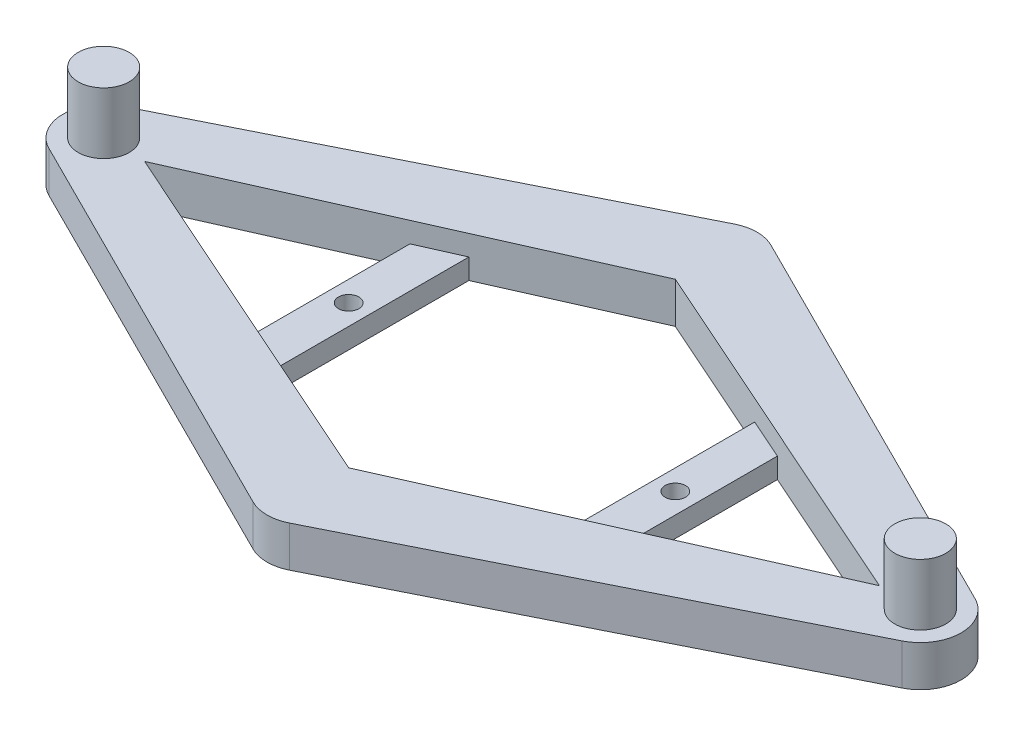
ISO-10303-21;
HEADER;
FILE_DESCRIPTION(('STEP AP214'),'2;1');
FILE_NAME('part.step','',(''),(''),'','','');
FILE_SCHEMA(('AUTOMOTIVE_DESIGN { 1 0 10303 214 1 1 1 1 }'));
ENDSEC;
DATA;
#1=APPLICATION_CONTEXT('core data for automotive mechanical design processes');
#2=APPLICATION_PROTOCOL_DEFINITION('international standard','automotive_design',2000,#1);
#3=PRODUCT_CONTEXT('',#1,'mechanical');
#4=PRODUCT('Part','Part','',(#3));
#5=PRODUCT_RELATED_PRODUCT_CATEGORY('part','',(#4));
#6=PRODUCT_DEFINITION_FORMATION('','',#4);
#7=PRODUCT_DEFINITION_CONTEXT('part definition',#1,'design');
#8=PRODUCT_DEFINITION('design','',#6,#7);
#9=PRODUCT_DEFINITION_SHAPE('','',#8);
#10=(LENGTH_UNIT() NAMED_UNIT(*) SI_UNIT(.MILLI.,.METRE.));
#11=(NAMED_UNIT(*) PLANE_ANGLE_UNIT() SI_UNIT($,.RADIAN.));
#12=(NAMED_UNIT(*) SI_UNIT($,.STERADIAN.) SOLID_ANGLE_UNIT());
#13=UNCERTAINTY_MEASURE_WITH_UNIT(LENGTH_MEASURE(1.E-05),#10,'distance_accuracy_value','');
#14=(GEOMETRIC_REPRESENTATION_CONTEXT(3) GLOBAL_UNCERTAINTY_ASSIGNED_CONTEXT((#13)) GLOBAL_UNIT_ASSIGNED_CONTEXT((#10,
#11,#12)) REPRESENTATION_CONTEXT('',''));
#15=CARTESIAN_POINT('',(0.,0.,0.));
#16=DIRECTION('',(0.,0.,1.));
#17=DIRECTION('',(1.,0.,0.));
#18=AXIS2_PLACEMENT_3D('',#15,#16,#17);
#19=CARTESIAN_POINT('',(45.72,5.08,0.));
#20=DIRECTION('',(-0.406138466053448,0.,-0.913811548620257));
#21=DIRECTION('',(-0.913811548620257,0.,0.406138466053448));
#22=AXIS2_PLACEMENT_3D('',#19,#20,#21);
#23=PLANE('',#22);
#24=DIRECTION('',(0.913811548620257,0.,-0.406138466053448));
#25=VECTOR('',#24,1.);
#26=CARTESIAN_POINT('',(45.72,0.,0.));
#27=LINE('',#26,#25);
#28=CARTESIAN_POINT('',(22.86,0.,10.16));
#29=VERTEX_POINT('',#28);
#30=CARTESIAN_POINT('',(45.72,0.,0.));
#31=VERTEX_POINT('',#30);
#32=EDGE_CURVE('E221',#29,#31,#27,.T.);
#33=ORIENTED_EDGE('',*,*,#32,.F.);
#34=DIRECTION('',(0.,-1.,0.));
#35=VECTOR('',#34,1.);
#36=CARTESIAN_POINT('',(22.86,2.54,10.16));
#37=LINE('',#36,#35);
#38=CARTESIAN_POINT('',(22.86,2.54,10.16));
#39=VERTEX_POINT('',#38);
#40=EDGE_CURVE('E199',#39,#29,#37,.T.);
#41=ORIENTED_EDGE('',*,*,#40,.F.);
#42=DIRECTION('',(0.913811548620257,0.,-0.406138466053447));
#43=VECTOR('',#42,1.);
#44=CARTESIAN_POINT('',(22.86,2.54,10.16));
#45=LINE('',#44,#43);
#46=CARTESIAN_POINT('',(17.78,2.54,12.4177777777778));
#47=VERTEX_POINT('',#46);
#48=EDGE_CURVE('E177',#47,#39,#45,.T.);
#49=ORIENTED_EDGE('',*,*,#48,.F.);
#50=DIRECTION('',(0.,-1.,0.));
#51=VECTOR('',#50,1.);
#52=CARTESIAN_POINT('',(17.78,2.54,12.4177777777778));
#53=LINE('',#52,#51);
#54=CARTESIAN_POINT('',(17.78,0.,12.4177777777778));
#55=VERTEX_POINT('',#54);
#56=EDGE_CURVE('E204',#47,#55,#53,.T.);
#57=ORIENTED_EDGE('',*,*,#56,.T.);
#58=CARTESIAN_POINT('',(0.,0.,20.32));
#59=VERTEX_POINT('',#58);
#60=EDGE_CURVE('E222',#59,#55,#27,.T.);
#61=ORIENTED_EDGE('',*,*,#60,.F.);
#62=DIRECTION('',(0.,-1.,0.));
#63=VECTOR('',#62,1.);
#64=CARTESIAN_POINT('',(0.,5.08,20.32));
#65=LINE('',#64,#63);
#66=CARTESIAN_POINT('',(0.,5.08,20.32));
#67=VERTEX_POINT('',#66);
#68=EDGE_CURVE('E239',#67,#59,#65,.T.);
#69=ORIENTED_EDGE('',*,*,#68,.F.);
#70=DIRECTION('',(0.913811548620257,0.,-0.406138466053448));
#71=VECTOR('',#70,1.);
#72=CARTESIAN_POINT('',(45.72,5.08,0.));
#73=LINE('',#72,#71);
#74=CARTESIAN_POINT('',(45.72,5.08,0.));
#75=VERTEX_POINT('',#74);
#76=EDGE_CURVE('E209',#67,#75,#73,.T.);
#77=ORIENTED_EDGE('',*,*,#76,.T.);
#78=DIRECTION('',(0.,-1.,0.));
#79=VECTOR('',#78,1.);
#80=CARTESIAN_POINT('',(45.72,5.08,0.));
#81=LINE('',#80,#79);
#82=EDGE_CURVE('E236',#75,#31,#81,.T.);
#83=ORIENTED_EDGE('',*,*,#82,.T.);
#84=EDGE_LOOP('',(#33,#41,#49,#57,#61,#69,#77,#83));
#85=FACE_BOUND('',#84,.T.);
#86=ADVANCED_FACE('F33',(#85),#23,.T.);
#87=CARTESIAN_POINT('',(0.,5.08,-20.32));
#88=DIRECTION('',(-0.406138466053448,0.,0.913811548620257));
#89=DIRECTION('',(0.913811548620257,0.,0.406138466053448));
#90=AXIS2_PLACEMENT_3D('',#87,#88,#89);
#91=PLANE('',#90);
#92=DIRECTION('',(-0.913811548620257,0.,-0.406138466053448));
#93=VECTOR('',#92,1.);
#94=CARTESIAN_POINT('',(22.86,2.54,-10.16));
#95=LINE('',#94,#93);
#96=CARTESIAN_POINT('',(22.86,2.54,-10.16));
#97=VERTEX_POINT('',#96);
#98=CARTESIAN_POINT('',(17.78,2.54,-12.4177777777778));
#99=VERTEX_POINT('',#98);
#100=EDGE_CURVE('E174',#97,#99,#95,.T.);
#101=ORIENTED_EDGE('',*,*,#100,.F.);
#102=DIRECTION('',(0.,-1.,0.));
#103=VECTOR('',#102,1.);
#104=CARTESIAN_POINT('',(22.86,2.54,-10.16));
#105=LINE('',#104,#103);
#106=CARTESIAN_POINT('',(22.86,0.,-10.16));
#107=VERTEX_POINT('',#106);
#108=EDGE_CURVE('E182',#97,#107,#105,.T.);
#109=ORIENTED_EDGE('',*,*,#108,.T.);
#110=DIRECTION('',(-0.913811548620257,0.,-0.406138466053448));
#111=VECTOR('',#110,1.);
#112=CARTESIAN_POINT('',(0.,0.,-20.32));
#113=LINE('',#112,#111);
#114=EDGE_CURVE('E226',#31,#107,#113,.T.);
#115=ORIENTED_EDGE('',*,*,#114,.F.);
#116=ORIENTED_EDGE('',*,*,#82,.F.);
#117=DIRECTION('',(-0.913811548620257,0.,-0.406138466053448));
#118=VECTOR('',#117,1.);
#119=CARTESIAN_POINT('',(0.,5.08,-20.32));
#120=LINE('',#119,#118);
#121=CARTESIAN_POINT('',(0.,5.08,-20.32));
#122=VERTEX_POINT('',#121);
#123=EDGE_CURVE('E212',#75,#122,#120,.T.);
#124=ORIENTED_EDGE('',*,*,#123,.T.);
#125=DIRECTION('',(0.,-1.,0.));
#126=VECTOR('',#125,1.);
#127=CARTESIAN_POINT('',(0.,5.08,-20.32));
#128=LINE('',#127,#126);
#129=CARTESIAN_POINT('',(0.,0.,-20.32));
#130=VERTEX_POINT('',#129);
#131=EDGE_CURVE('E233',#122,#130,#128,.T.);
#132=ORIENTED_EDGE('',*,*,#131,.T.);
#133=CARTESIAN_POINT('',(17.78,0.,-12.4177777777778));
#134=VERTEX_POINT('',#133);
#135=EDGE_CURVE('E225',#134,#130,#113,.T.);
#136=ORIENTED_EDGE('',*,*,#135,.F.);
#137=DIRECTION('',(0.,-1.,0.));
#138=VECTOR('',#137,1.);
#139=CARTESIAN_POINT('',(17.78,2.54,-12.4177777777778));
#140=LINE('',#139,#138);
#141=EDGE_CURVE('E190',#99,#134,#140,.T.);
#142=ORIENTED_EDGE('',*,*,#141,.F.);
#143=EDGE_LOOP('',(#101,#109,#115,#116,#124,#132,#136,#142));
#144=FACE_BOUND('',#143,.T.);
#145=ADVANCED_FACE('F192',(#144),#91,.T.);
#146=CARTESIAN_POINT('',(0.,2.54,0.));
#147=DIRECTION('',(0.,-1.,0.));
#148=DIRECTION('',(0.,0.,-1.));
#149=AXIS2_PLACEMENT_3D('',#146,#147,#148);
#150=PLANE('',#149);
#151=DIRECTION('',(-0.913811548620257,0.,0.406138466053448));
#152=VECTOR('',#151,1.);
#153=CARTESIAN_POINT('',(-22.86,2.54,-10.16));
#154=LINE('',#153,#152);
#155=CARTESIAN_POINT('',(-17.78,2.54,-12.4177777777778));
#156=VERTEX_POINT('',#155);
#157=CARTESIAN_POINT('',(-22.86,2.54,-10.16));
#158=VERTEX_POINT('',#157);
#159=EDGE_CURVE('E307',#156,#158,#154,.T.);
#160=ORIENTED_EDGE('',*,*,#159,.T.);
#161=DIRECTION('',(0.,0.,1.));
#162=VECTOR('',#161,1.);
#163=CARTESIAN_POINT('',(-22.86,2.54,-10.16));
#164=LINE('',#163,#162);
#165=CARTESIAN_POINT('',(-22.86,2.54,10.16));
#166=VERTEX_POINT('',#165);
#167=EDGE_CURVE('E310',#158,#166,#164,.T.);
#168=ORIENTED_EDGE('',*,*,#167,.T.);
#169=DIRECTION('',(0.913811548620257,0.,0.406138466053447));
#170=VECTOR('',#169,1.);
#171=CARTESIAN_POINT('',(-22.86,2.54,10.16));
#172=LINE('',#171,#170);
#173=CARTESIAN_POINT('',(-17.78,2.54,12.4177777777778));
#174=VERTEX_POINT('',#173);
#175=EDGE_CURVE('E314',#166,#174,#172,.T.);
#176=ORIENTED_EDGE('',*,*,#175,.T.);
#177=DIRECTION('',(0.,0.,-1.));
#178=VECTOR('',#177,1.);
#179=CARTESIAN_POINT('',(-17.78,2.54,-12.4177777777778));
#180=LINE('',#179,#178);
#181=EDGE_CURVE('E317',#174,#156,#180,.T.);
#182=ORIENTED_EDGE('',*,*,#181,.T.);
#183=EDGE_LOOP('',(#160,#168,#176,#182));
#184=FACE_BOUND('',#183,.T.);
#185=CARTESIAN_POINT('',(-20.32,2.54,0.));
#186=DIRECTION('',(0.,1.,0.));
#187=DIRECTION('',(0.,0.,1.));
#188=AXIS2_PLACEMENT_3D('',#185,#186,#187);
#189=CIRCLE('',#188,1.27);
#190=CARTESIAN_POINT('',(-20.32,2.54,1.27));
#191=VERTEX_POINT('',#190);
#192=EDGE_CURVE('E301',#191,#191,#189,.T.);
#193=ORIENTED_EDGE('',*,*,#192,.F.);
#194=EDGE_LOOP('',(#193));
#195=FACE_BOUND('',#194,.T.);
#196=ADVANCED_FACE('F362',(#184,#195),#150,.F.);
#197=CARTESIAN_POINT('',(0.,0.,0.));
#198=DIRECTION('',(0.,-1.,0.));
#199=DIRECTION('',(0.,0.,-1.));
#200=AXIS2_PLACEMENT_3D('',#197,#198,#199);
#201=PLANE('',#200);
#202=DIRECTION('',(0.,0.,-1.));
#203=VECTOR('',#202,1.);
#204=CARTESIAN_POINT('',(22.86,0.,-10.16));
#205=LINE('',#204,#203);
#206=EDGE_CURVE('E185',#29,#107,#205,.T.);
#207=ORIENTED_EDGE('',*,*,#206,.F.);
#208=ORIENTED_EDGE('',*,*,#32,.T.);
#209=ORIENTED_EDGE('',*,*,#114,.T.);
#210=EDGE_LOOP('',(#207,#208,#209));
#211=FACE_BOUND('',#210,.T.);
#212=DIRECTION('',(0.,0.,1.));
#213=VECTOR('',#212,1.);
#214=CARTESIAN_POINT('',(-22.86,0.,-10.16));
#215=LINE('',#214,#213);
#216=CARTESIAN_POINT('',(-22.86,0.,-10.16));
#217=VERTEX_POINT('',#216);
#218=CARTESIAN_POINT('',(-22.86,0.,10.16));
#219=VERTEX_POINT('',#218);
#220=EDGE_CURVE('E304',#217,#219,#215,.T.);
#221=ORIENTED_EDGE('',*,*,#220,.F.);
#222=DIRECTION('',(-0.913811548620257,0.,0.406138466053448));
#223=VECTOR('',#222,1.);
#224=CARTESIAN_POINT('',(-45.72,0.,0.));
#225=LINE('',#224,#223);
#226=CARTESIAN_POINT('',(-45.72,0.,0.));
#227=VERTEX_POINT('',#226);
#228=EDGE_CURVE('E228',#217,#227,#225,.T.);
#229=ORIENTED_EDGE('',*,*,#228,.T.);
#230=DIRECTION('',(0.913811548620257,0.,0.406138466053448));
#231=VECTOR('',#230,1.);
#232=CARTESIAN_POINT('',(0.,0.,20.32));
#233=LINE('',#232,#231);
#234=EDGE_CURVE('E218',#227,#219,#233,.T.);
#235=ORIENTED_EDGE('',*,*,#234,.T.);
#236=EDGE_LOOP('',(#221,#229,#235));
#237=FACE_BOUND('',#236,.T.);
#238=CARTESIAN_POINT('',(-17.78,0.,-12.4177777777778));
#239=VERTEX_POINT('',#238);
#240=EDGE_CURVE('E210',#130,#239,#225,.T.);
#241=ORIENTED_EDGE('',*,*,#240,.T.);
#242=DIRECTION('',(0.,0.,-1.));
#243=VECTOR('',#242,1.);
#244=CARTESIAN_POINT('',(-17.78,0.,-12.4177777777778));
#245=LINE('',#244,#243);
#246=CARTESIAN_POINT('',(-17.78,0.,12.4177777777778));
#247=VERTEX_POINT('',#246);
#248=EDGE_CURVE('E311',#247,#239,#245,.T.);
#249=ORIENTED_EDGE('',*,*,#248,.F.);
#250=EDGE_CURVE('E189',#247,#59,#233,.T.);
#251=ORIENTED_EDGE('',*,*,#250,.T.);
#252=ORIENTED_EDGE('',*,*,#60,.T.);
#253=DIRECTION('',(0.,0.,1.));
#254=VECTOR('',#253,1.);
#255=CARTESIAN_POINT('',(17.78,0.,-12.4177777777778));
#256=LINE('',#255,#254);
#257=EDGE_CURVE('E49',#134,#55,#256,.T.);
#258=ORIENTED_EDGE('',*,*,#257,.F.);
#259=ORIENTED_EDGE('',*,*,#135,.T.);
#260=EDGE_LOOP('',(#241,#249,#251,#252,#258,#259));
#261=FACE_BOUND('',#260,.T.);
#262=CARTESIAN_POINT('',(-20.32,0.,0.));
#263=DIRECTION('',(0.,1.,0.));
#264=DIRECTION('',(0.,0.,1.));
#265=AXIS2_PLACEMENT_3D('',#262,#263,#264);
#266=CIRCLE('',#265,1.27);
#267=CARTESIAN_POINT('',(-20.32,0.,1.27));
#268=VERTEX_POINT('',#267);
#269=EDGE_CURVE('E300',#268,#268,#266,.T.);
#270=ORIENTED_EDGE('',*,*,#269,.T.);
#271=EDGE_LOOP('',(#270));
#272=FACE_BOUND('',#271,.T.);
#273=CARTESIAN_POINT('',(-50.8,0.,0.));
#274=DIRECTION('',(0.,1.,0.));
#275=DIRECTION('',(0.,0.,1.));
#276=AXIS2_PLACEMENT_3D('',#273,#274,#275);
#277=CIRCLE('',#276,5.08);
#278=CARTESIAN_POINT('',(-53.0718450651398,0.,-4.54369013027957));
#279=VERTEX_POINT('',#278);
#280=CARTESIAN_POINT('',(-53.0718450651398,0.,4.54369013027958));
#281=VERTEX_POINT('',#280);
#282=EDGE_CURVE('E242',#279,#281,#277,.T.);
#283=ORIENTED_EDGE('',*,*,#282,.F.);
#284=DIRECTION('',(-0.894427190999916,0.,0.447213595499958));
#285=VECTOR('',#284,1.);
#286=CARTESIAN_POINT('',(-53.0718450651398,0.,-4.54369013027957));
#287=LINE('',#286,#285);
#288=CARTESIAN_POINT('',(-2.27184506513979,0.,-29.9436901302796));
#289=VERTEX_POINT('',#288);
#290=EDGE_CURVE('E247',#289,#279,#287,.T.);
#291=ORIENTED_EDGE('',*,*,#290,.F.);
#292=CARTESIAN_POINT('',(0.,0.,-25.4));
#293=DIRECTION('',(0.,1.,0.));
#294=DIRECTION('',(0.,0.,1.));
#295=AXIS2_PLACEMENT_3D('',#292,#293,#294);
#296=CIRCLE('',#295,5.08);
#297=CARTESIAN_POINT('',(2.27184506513979,0.,-29.9436901302796));
#298=VERTEX_POINT('',#297);
#299=EDGE_CURVE('E274',#298,#289,#296,.T.);
#300=ORIENTED_EDGE('',*,*,#299,.F.);
#301=DIRECTION('',(-0.894427190999916,0.,-0.447213595499958));
#302=VECTOR('',#301,1.);
#303=CARTESIAN_POINT('',(2.27184506513979,0.,-29.9436901302796));
#304=LINE('',#303,#302);
#305=CARTESIAN_POINT('',(53.0718450651398,0.,-4.54369013027957));
#306=VERTEX_POINT('',#305);
#307=EDGE_CURVE('E272',#306,#298,#304,.T.);
#308=ORIENTED_EDGE('',*,*,#307,.F.);
#309=CARTESIAN_POINT('',(50.8,0.,0.));
#310=DIRECTION('',(0.,1.,0.));
#311=DIRECTION('',(0.,0.,1.));
#312=AXIS2_PLACEMENT_3D('',#309,#310,#311);
#313=CIRCLE('',#312,5.08);
#314=CARTESIAN_POINT('',(53.0718450651398,0.,4.54369013027957));
#315=VERTEX_POINT('',#314);
#316=EDGE_CURVE('E270',#315,#306,#313,.T.);
#317=ORIENTED_EDGE('',*,*,#316,.F.);
#318=DIRECTION('',(0.894427190999916,0.,-0.447213595499958));
#319=VECTOR('',#318,1.);
#320=CARTESIAN_POINT('',(53.0718450651398,0.,4.54369013027957));
#321=LINE('',#320,#319);
#322=CARTESIAN_POINT('',(2.27184506513979,0.,29.9436901302796));
#323=VERTEX_POINT('',#322);
#324=EDGE_CURVE('E268',#323,#315,#321,.T.);
#325=ORIENTED_EDGE('',*,*,#324,.F.);
#326=CARTESIAN_POINT('',(0.,0.,25.4));
#327=DIRECTION('',(0.,1.,0.));
#328=DIRECTION('',(0.,0.,1.));
#329=AXIS2_PLACEMENT_3D('',#326,#327,#328);
#330=CIRCLE('',#329,5.08);
#331=CARTESIAN_POINT('',(-2.27184506513979,0.,29.9436901302796));
#332=VERTEX_POINT('',#331);
#333=EDGE_CURVE('E266',#332,#323,#330,.T.);
#334=ORIENTED_EDGE('',*,*,#333,.F.);
#335=DIRECTION('',(0.894427190999916,0.,0.447213595499958));
#336=VECTOR('',#335,1.);
#337=CARTESIAN_POINT('',(-53.0718450651398,0.,4.54369013027958));
#338=LINE('',#337,#336);
#339=EDGE_CURVE('E264',#281,#332,#338,.T.);
#340=ORIENTED_EDGE('',*,*,#339,.F.);
#341=EDGE_LOOP('',(#283,#291,#300,#308,#317,#325,#334,#340));
#342=FACE_BOUND('',#341,.T.);
#343=CARTESIAN_POINT('',(20.32,0.,0.));
#344=DIRECTION('',(0.,1.,0.));
#345=DIRECTION('',(0.,0.,-1.));
#346=AXIS2_PLACEMENT_3D('',#343,#344,#345);
#347=CIRCLE('',#346,1.27);
#348=CARTESIAN_POINT('',(20.32,0.,-1.27));
#349=VERTEX_POINT('',#348);
#350=EDGE_CURVE('E382',#349,#349,#347,.T.);
#351=ORIENTED_EDGE('',*,*,#350,.T.);
#352=EDGE_LOOP('',(#351));
#353=FACE_BOUND('',#352,.T.);
#354=ADVANCED_FACE('F340',(#211,#237,#261,#272,#342,#353),#201,.T.);
#355=CARTESIAN_POINT('',(-22.86,2.54,-10.16));
#356=DIRECTION('',(1.,0.,0.));
#357=DIRECTION('',(0.,0.,-1.));
#358=AXIS2_PLACEMENT_3D('',#355,#356,#357);
#359=PLANE('',#358);
#360=ORIENTED_EDGE('',*,*,#220,.T.);
#361=DIRECTION('',(0.,-1.,0.));
#362=VECTOR('',#361,1.);
#363=CARTESIAN_POINT('',(-22.86,2.54,10.16));
#364=LINE('',#363,#362);
#365=EDGE_CURVE('E327',#166,#219,#364,.T.);
#366=ORIENTED_EDGE('',*,*,#365,.F.);
#367=ORIENTED_EDGE('',*,*,#167,.F.);
#368=DIRECTION('',(0.,-1.,0.));
#369=VECTOR('',#368,1.);
#370=CARTESIAN_POINT('',(-22.86,2.54,-10.16));
#371=LINE('',#370,#369);
#372=EDGE_CURVE('E37',#158,#217,#371,.T.);
#373=ORIENTED_EDGE('',*,*,#372,.T.);
#374=EDGE_LOOP('',(#360,#366,#367,#373));
#375=FACE_BOUND('',#374,.T.);
#376=ADVANCED_FACE('F35',(#375),#359,.F.);
#377=CARTESIAN_POINT('',(-17.78,2.54,-12.4177777777778));
#378=DIRECTION('',(-1.,0.,0.));
#379=DIRECTION('',(0.,0.,1.));
#380=AXIS2_PLACEMENT_3D('',#377,#378,#379);
#381=PLANE('',#380);
#382=ORIENTED_EDGE('',*,*,#248,.T.);
#383=DIRECTION('',(0.,-1.,0.));
#384=VECTOR('',#383,1.);
#385=CARTESIAN_POINT('',(-17.78,2.54,-12.4177777777778));
#386=LINE('',#385,#384);
#387=EDGE_CURVE('E319',#156,#239,#386,.T.);
#388=ORIENTED_EDGE('',*,*,#387,.F.);
#389=ORIENTED_EDGE('',*,*,#181,.F.);
#390=DIRECTION('',(0.,-1.,0.));
#391=VECTOR('',#390,1.);
#392=CARTESIAN_POINT('',(-17.78,2.54,12.4177777777778));
#393=LINE('',#392,#391);
#394=EDGE_CURVE('E325',#174,#247,#393,.T.);
#395=ORIENTED_EDGE('',*,*,#394,.T.);
#396=EDGE_LOOP('',(#382,#388,#389,#395));
#397=FACE_BOUND('',#396,.T.);
#398=ADVANCED_FACE('F359',(#397),#381,.F.);
#399=CARTESIAN_POINT('',(-20.32,2.54,0.));
#400=DIRECTION('',(0.,-1.,0.));
#401=DIRECTION('',(0.,0.,-1.));
#402=AXIS2_PLACEMENT_3D('',#399,#400,#401);
#403=CYLINDRICAL_SURFACE('',#402,1.27);
#404=ORIENTED_EDGE('',*,*,#192,.T.);
#405=EDGE_LOOP('',(#404));
#406=FACE_BOUND('',#405,.T.);
#407=ORIENTED_EDGE('',*,*,#269,.F.);
#408=EDGE_LOOP('',(#407));
#409=FACE_BOUND('',#408,.T.);
#410=ADVANCED_FACE('F369',(#406,#409),#403,.F.);
#411=CARTESIAN_POINT('',(0.,5.08,20.32));
#412=DIRECTION('',(0.406138466053448,0.,-0.913811548620257));
#413=DIRECTION('',(-0.913811548620257,0.,-0.406138466053448));
#414=AXIS2_PLACEMENT_3D('',#411,#412,#413);
#415=PLANE('',#414);
#416=ORIENTED_EDGE('',*,*,#365,.T.);
#417=ORIENTED_EDGE('',*,*,#234,.F.);
#418=DIRECTION('',(0.,-1.,0.));
#419=VECTOR('',#418,1.);
#420=CARTESIAN_POINT('',(-45.72,5.08,0.));
#421=LINE('',#420,#419);
#422=CARTESIAN_POINT('',(-45.72,5.08,0.));
#423=VERTEX_POINT('',#422);
#424=EDGE_CURVE('E217',#423,#227,#421,.T.);
#425=ORIENTED_EDGE('',*,*,#424,.F.);
#426=DIRECTION('',(0.913811548620257,0.,0.406138466053448));
#427=VECTOR('',#426,1.);
#428=CARTESIAN_POINT('',(0.,5.08,20.32));
#429=LINE('',#428,#427);
#430=EDGE_CURVE('E207',#423,#67,#429,.T.);
#431=ORIENTED_EDGE('',*,*,#430,.T.);
#432=ORIENTED_EDGE('',*,*,#68,.T.);
#433=ORIENTED_EDGE('',*,*,#250,.F.);
#434=ORIENTED_EDGE('',*,*,#394,.F.);
#435=ORIENTED_EDGE('',*,*,#175,.F.);
#436=EDGE_LOOP('',(#416,#417,#425,#431,#432,#433,#434,#435));
#437=FACE_BOUND('',#436,.T.);
#438=ADVANCED_FACE('F342',(#437),#415,.T.);
#439=CARTESIAN_POINT('',(-45.72,5.08,0.));
#440=DIRECTION('',(0.406138466053448,0.,0.913811548620257));
#441=DIRECTION('',(0.913811548620257,0.,-0.406138466053448));
#442=AXIS2_PLACEMENT_3D('',#439,#440,#441);
#443=PLANE('',#442);
#444=ORIENTED_EDGE('',*,*,#372,.F.);
#445=ORIENTED_EDGE('',*,*,#159,.F.);
#446=ORIENTED_EDGE('',*,*,#387,.T.);
#447=ORIENTED_EDGE('',*,*,#240,.F.);
#448=ORIENTED_EDGE('',*,*,#131,.F.);
#449=DIRECTION('',(-0.913811548620257,0.,0.406138466053448));
#450=VECTOR('',#449,1.);
#451=CARTESIAN_POINT('',(-45.72,5.08,0.));
#452=LINE('',#451,#450);
#453=EDGE_CURVE('E215',#122,#423,#452,.T.);
#454=ORIENTED_EDGE('',*,*,#453,.T.);
#455=ORIENTED_EDGE('',*,*,#424,.T.);
#456=ORIENTED_EDGE('',*,*,#228,.F.);
#457=EDGE_LOOP('',(#444,#445,#446,#447,#448,#454,#455,#456));
#458=FACE_BOUND('',#457,.T.);
#459=ADVANCED_FACE('F337',(#458),#443,.T.);
#460=CARTESIAN_POINT('',(-50.8,5.08,0.));
#461=DIRECTION('',(0.,1.,0.));
#462=DIRECTION('',(0.,0.,1.));
#463=AXIS2_PLACEMENT_3D('',#460,#461,#462);
#464=PLANE('',#463);
#465=CARTESIAN_POINT('',(50.8,5.08,0.));
#466=DIRECTION('',(0.,1.,0.));
#467=DIRECTION('',(0.,0.,1.));
#468=AXIS2_PLACEMENT_3D('',#465,#466,#467);
#469=CIRCLE('',#468,3.17500000000001);
#470=CARTESIAN_POINT('',(50.8,5.08,-3.17500000000001));
#471=VERTEX_POINT('',#470);
#472=EDGE_CURVE('E391',#471,#471,#469,.T.);
#473=ORIENTED_EDGE('',*,*,#472,.F.);
#474=EDGE_LOOP('',(#473));
#475=FACE_BOUND('',#474,.T.);
#476=CARTESIAN_POINT('',(-50.8,5.08,0.));
#477=DIRECTION('',(0.,1.,0.));
#478=DIRECTION('',(0.,0.,1.));
#479=AXIS2_PLACEMENT_3D('',#476,#477,#478);
#480=CIRCLE('',#479,3.175);
#481=CARTESIAN_POINT('',(-50.8,5.08,-3.175));
#482=VERTEX_POINT('',#481);
#483=EDGE_CURVE('E11',#482,#482,#480,.T.);
#484=ORIENTED_EDGE('',*,*,#483,.F.);
#485=EDGE_LOOP('',(#484));
#486=FACE_BOUND('',#485,.T.);
#487=CARTESIAN_POINT('',(-50.8,5.08,0.));
#488=DIRECTION('',(0.,1.,0.));
#489=DIRECTION('',(0.,0.,1.));
#490=AXIS2_PLACEMENT_3D('',#487,#488,#489);
#491=CIRCLE('',#490,5.08);
#492=CARTESIAN_POINT('',(-53.0718450651398,5.08,-4.54369013027957));
#493=VERTEX_POINT('',#492);
#494=CARTESIAN_POINT('',(-53.0718450651398,5.08,4.54369013027958));
#495=VERTEX_POINT('',#494);
#496=EDGE_CURVE('E243',#493,#495,#491,.T.);
#497=ORIENTED_EDGE('',*,*,#496,.T.);
#498=DIRECTION('',(0.894427190999916,0.,0.447213595499958));
#499=VECTOR('',#498,1.);
#500=CARTESIAN_POINT('',(-53.0718450651398,5.08,4.54369013027958));
#501=LINE('',#500,#499);
#502=CARTESIAN_POINT('',(-2.27184506513979,5.08,29.9436901302796));
#503=VERTEX_POINT('',#502);
#504=EDGE_CURVE('E246',#495,#503,#501,.T.);
#505=ORIENTED_EDGE('',*,*,#504,.T.);
#506=CARTESIAN_POINT('',(0.,5.08,25.4));
#507=DIRECTION('',(0.,1.,0.));
#508=DIRECTION('',(0.,0.,1.));
#509=AXIS2_PLACEMENT_3D('',#506,#507,#508);
#510=CIRCLE('',#509,5.08);
#511=CARTESIAN_POINT('',(2.27184506513979,5.08,29.9436901302796));
#512=VERTEX_POINT('',#511);
#513=EDGE_CURVE('E249',#503,#512,#510,.T.);
#514=ORIENTED_EDGE('',*,*,#513,.T.);
#515=DIRECTION('',(0.894427190999916,0.,-0.447213595499958));
#516=VECTOR('',#515,1.);
#517=CARTESIAN_POINT('',(53.0718450651398,5.08,4.54369013027957));
#518=LINE('',#517,#516);
#519=CARTESIAN_POINT('',(53.0718450651398,5.08,4.54369013027957));
#520=VERTEX_POINT('',#519);
#521=EDGE_CURVE('E251',#512,#520,#518,.T.);
#522=ORIENTED_EDGE('',*,*,#521,.T.);
#523=CARTESIAN_POINT('',(50.8,5.08,0.));
#524=DIRECTION('',(0.,1.,0.));
#525=DIRECTION('',(0.,0.,1.));
#526=AXIS2_PLACEMENT_3D('',#523,#524,#525);
#527=CIRCLE('',#526,5.08);
#528=CARTESIAN_POINT('',(53.0718450651398,5.08,-4.54369013027957));
#529=VERTEX_POINT('',#528);
#530=EDGE_CURVE('E253',#520,#529,#527,.T.);
#531=ORIENTED_EDGE('',*,*,#530,.T.);
#532=DIRECTION('',(-0.894427190999916,0.,-0.447213595499958));
#533=VECTOR('',#532,1.);
#534=CARTESIAN_POINT('',(2.27184506513979,5.08,-29.9436901302796));
#535=LINE('',#534,#533);
#536=CARTESIAN_POINT('',(2.27184506513979,5.08,-29.9436901302796));
#537=VERTEX_POINT('',#536);
#538=EDGE_CURVE('E255',#529,#537,#535,.T.);
#539=ORIENTED_EDGE('',*,*,#538,.T.);
#540=CARTESIAN_POINT('',(0.,5.08,-25.4));
#541=DIRECTION('',(0.,1.,0.));
#542=DIRECTION('',(0.,0.,1.));
#543=AXIS2_PLACEMENT_3D('',#540,#541,#542);
#544=CIRCLE('',#543,5.08);
#545=CARTESIAN_POINT('',(-2.27184506513979,5.08,-29.9436901302796));
#546=VERTEX_POINT('',#545);
#547=EDGE_CURVE('E257',#537,#546,#544,.T.);
#548=ORIENTED_EDGE('',*,*,#547,.T.);
#549=DIRECTION('',(-0.894427190999916,0.,0.447213595499958));
#550=VECTOR('',#549,1.);
#551=CARTESIAN_POINT('',(-53.0718450651398,5.08,-4.54369013027957));
#552=LINE('',#551,#550);
#553=EDGE_CURVE('E259',#546,#493,#552,.T.);
#554=ORIENTED_EDGE('',*,*,#553,.T.);
#555=EDGE_LOOP('',(#497,#505,#514,#522,#531,#539,#548,#554));
#556=FACE_BOUND('',#555,.T.);
#557=ORIENTED_EDGE('',*,*,#76,.F.);
#558=ORIENTED_EDGE('',*,*,#430,.F.);
#559=ORIENTED_EDGE('',*,*,#453,.F.);
#560=ORIENTED_EDGE('',*,*,#123,.F.);
#561=EDGE_LOOP('',(#557,#558,#559,#560));
#562=FACE_BOUND('',#561,.T.);
#563=ADVANCED_FACE('F348',(#475,#486,#556,#562),#464,.T.);
#564=CARTESIAN_POINT('',(-50.8,5.08,0.));
#565=DIRECTION('',(0.,-1.,0.));
#566=DIRECTION('',(0.,0.,-1.));
#567=AXIS2_PLACEMENT_3D('',#564,#565,#566);
#568=CYLINDRICAL_SURFACE('',#567,5.08);
#569=ORIENTED_EDGE('',*,*,#282,.T.);
#570=DIRECTION('',(0.,-1.,0.));
#571=VECTOR('',#570,1.);
#572=CARTESIAN_POINT('',(-53.0718450651398,5.08,4.54369013027958));
#573=LINE('',#572,#571);
#574=EDGE_CURVE('E297',#495,#281,#573,.T.);
#575=ORIENTED_EDGE('',*,*,#574,.F.);
#576=ORIENTED_EDGE('',*,*,#496,.F.);
#577=DIRECTION('',(0.,-1.,0.));
#578=VECTOR('',#577,1.);
#579=CARTESIAN_POINT('',(-53.0718450651398,5.08,-4.54369013027957));
#580=LINE('',#579,#578);
#581=EDGE_CURVE('E261',#493,#279,#580,.T.);
#582=ORIENTED_EDGE('',*,*,#581,.T.);
#583=EDGE_LOOP('',(#569,#575,#576,#582));
#584=FACE_BOUND('',#583,.T.);
#585=ADVANCED_FACE('F408',(#584),#568,.T.);
#586=CARTESIAN_POINT('',(-53.0718450651398,5.08,4.54369013027958));
#587=DIRECTION('',(0.447213595499958,0.,-0.894427190999916));
#588=DIRECTION('',(-0.894427190999916,0.,-0.447213595499958));
#589=AXIS2_PLACEMENT_3D('',#586,#587,#588);
#590=PLANE('',#589);
#591=ORIENTED_EDGE('',*,*,#339,.T.);
#592=DIRECTION('',(0.,-1.,0.));
#593=VECTOR('',#592,1.);
#594=CARTESIAN_POINT('',(-2.27184506513979,5.08,29.9436901302796));
#595=LINE('',#594,#593);
#596=EDGE_CURVE('E294',#503,#332,#595,.T.);
#597=ORIENTED_EDGE('',*,*,#596,.F.);
#598=ORIENTED_EDGE('',*,*,#504,.F.);
#599=ORIENTED_EDGE('',*,*,#574,.T.);
#600=EDGE_LOOP('',(#591,#597,#598,#599));
#601=FACE_BOUND('',#600,.T.);
#602=ADVANCED_FACE('F419',(#601),#590,.F.);
#603=CARTESIAN_POINT('',(0.,5.08,25.4));
#604=DIRECTION('',(0.,-1.,0.));
#605=DIRECTION('',(0.,0.,-1.));
#606=AXIS2_PLACEMENT_3D('',#603,#604,#605);
#607=CYLINDRICAL_SURFACE('',#606,5.08);
#608=ORIENTED_EDGE('',*,*,#333,.T.);
#609=DIRECTION('',(0.,-1.,0.));
#610=VECTOR('',#609,1.);
#611=CARTESIAN_POINT('',(2.27184506513979,5.08,29.9436901302796));
#612=LINE('',#611,#610);
#613=EDGE_CURVE('E291',#512,#323,#612,.T.);
#614=ORIENTED_EDGE('',*,*,#613,.F.);
#615=ORIENTED_EDGE('',*,*,#513,.F.);
#616=ORIENTED_EDGE('',*,*,#596,.T.);
#617=EDGE_LOOP('',(#608,#614,#615,#616));
#618=FACE_BOUND('',#617,.T.);
#619=ADVANCED_FACE('F424',(#618),#607,.T.);
#620=CARTESIAN_POINT('',(53.0718450651398,5.08,4.54369013027957));
#621=DIRECTION('',(-0.447213595499958,0.,-0.894427190999916));
#622=DIRECTION('',(-0.894427190999916,0.,0.447213595499958));
#623=AXIS2_PLACEMENT_3D('',#620,#621,#622);
#624=PLANE('',#623);
#625=ORIENTED_EDGE('',*,*,#324,.T.);
#626=DIRECTION('',(0.,-1.,0.));
#627=VECTOR('',#626,1.);
#628=CARTESIAN_POINT('',(53.0718450651398,5.08,4.54369013027957));
#629=LINE('',#628,#627);
#630=EDGE_CURVE('E288',#520,#315,#629,.T.);
#631=ORIENTED_EDGE('',*,*,#630,.F.);
#632=ORIENTED_EDGE('',*,*,#521,.F.);
#633=ORIENTED_EDGE('',*,*,#613,.T.);
#634=EDGE_LOOP('',(#625,#631,#632,#633));
#635=FACE_BOUND('',#634,.T.);
#636=ADVANCED_FACE('F430',(#635),#624,.F.);
#637=CARTESIAN_POINT('',(50.8,5.08,0.));
#638=DIRECTION('',(0.,-1.,0.));
#639=DIRECTION('',(0.,0.,-1.));
#640=AXIS2_PLACEMENT_3D('',#637,#638,#639);
#641=CYLINDRICAL_SURFACE('',#640,5.08);
#642=ORIENTED_EDGE('',*,*,#316,.T.);
#643=DIRECTION('',(0.,-1.,0.));
#644=VECTOR('',#643,1.);
#645=CARTESIAN_POINT('',(53.0718450651398,5.08,-4.54369013027957));
#646=LINE('',#645,#644);
#647=EDGE_CURVE('E285',#529,#306,#646,.T.);
#648=ORIENTED_EDGE('',*,*,#647,.F.);
#649=ORIENTED_EDGE('',*,*,#530,.F.);
#650=ORIENTED_EDGE('',*,*,#630,.T.);
#651=EDGE_LOOP('',(#642,#648,#649,#650));
#652=FACE_BOUND('',#651,.T.);
#653=ADVANCED_FACE('F434',(#652),#641,.T.);
#654=CARTESIAN_POINT('',(2.27184506513979,5.08,-29.9436901302796));
#655=DIRECTION('',(-0.447213595499958,0.,0.894427190999916));
#656=DIRECTION('',(0.894427190999916,0.,0.447213595499958));
#657=AXIS2_PLACEMENT_3D('',#654,#655,#656);
#658=PLANE('',#657);
#659=ORIENTED_EDGE('',*,*,#307,.T.);
#660=DIRECTION('',(0.,-1.,0.));
#661=VECTOR('',#660,1.);
#662=CARTESIAN_POINT('',(2.27184506513979,5.08,-29.9436901302796));
#663=LINE('',#662,#661);
#664=EDGE_CURVE('E282',#537,#298,#663,.T.);
#665=ORIENTED_EDGE('',*,*,#664,.F.);
#666=ORIENTED_EDGE('',*,*,#538,.F.);
#667=ORIENTED_EDGE('',*,*,#647,.T.);
#668=EDGE_LOOP('',(#659,#665,#666,#667));
#669=FACE_BOUND('',#668,.T.);
#670=ADVANCED_FACE('F439',(#669),#658,.F.);
#671=CARTESIAN_POINT('',(0.,5.08,-25.4));
#672=DIRECTION('',(0.,-1.,0.));
#673=DIRECTION('',(0.,0.,-1.));
#674=AXIS2_PLACEMENT_3D('',#671,#672,#673);
#675=CYLINDRICAL_SURFACE('',#674,5.08);
#676=ORIENTED_EDGE('',*,*,#299,.T.);
#677=DIRECTION('',(0.,-1.,0.));
#678=VECTOR('',#677,1.);
#679=CARTESIAN_POINT('',(-2.27184506513979,5.08,-29.9436901302796));
#680=LINE('',#679,#678);
#681=EDGE_CURVE('E279',#546,#289,#680,.T.);
#682=ORIENTED_EDGE('',*,*,#681,.F.);
#683=ORIENTED_EDGE('',*,*,#547,.F.);
#684=ORIENTED_EDGE('',*,*,#664,.T.);
#685=EDGE_LOOP('',(#676,#682,#683,#684));
#686=FACE_BOUND('',#685,.T.);
#687=ADVANCED_FACE('F443',(#686),#675,.T.);
#688=CARTESIAN_POINT('',(-53.0718450651398,5.08,-4.54369013027957));
#689=DIRECTION('',(0.447213595499958,0.,0.894427190999916));
#690=DIRECTION('',(0.894427190999916,0.,-0.447213595499958));
#691=AXIS2_PLACEMENT_3D('',#688,#689,#690);
#692=PLANE('',#691);
#693=ORIENTED_EDGE('',*,*,#290,.T.);
#694=ORIENTED_EDGE('',*,*,#581,.F.);
#695=ORIENTED_EDGE('',*,*,#553,.F.);
#696=ORIENTED_EDGE('',*,*,#681,.T.);
#697=EDGE_LOOP('',(#693,#694,#695,#696));
#698=FACE_BOUND('',#697,.T.);
#699=ADVANCED_FACE('F446',(#698),#692,.F.);
#700=CARTESIAN_POINT('',(0.,2.54,0.));
#701=DIRECTION('',(0.,-1.,0.));
#702=DIRECTION('',(0.,0.,-1.));
#703=AXIS2_PLACEMENT_3D('',#700,#701,#702);
#704=PLANE('',#703);
#705=DIRECTION('',(0.,0.,-1.));
#706=VECTOR('',#705,1.);
#707=CARTESIAN_POINT('',(22.86,2.54,-10.16));
#708=LINE('',#707,#706);
#709=EDGE_CURVE('E169',#39,#97,#708,.T.);
#710=ORIENTED_EDGE('',*,*,#709,.T.);
#711=ORIENTED_EDGE('',*,*,#100,.T.);
#712=DIRECTION('',(0.,0.,1.));
#713=VECTOR('',#712,1.);
#714=CARTESIAN_POINT('',(17.78,2.54,-12.4177777777778));
#715=LINE('',#714,#713);
#716=EDGE_CURVE('E54',#99,#47,#715,.T.);
#717=ORIENTED_EDGE('',*,*,#716,.T.);
#718=ORIENTED_EDGE('',*,*,#48,.T.);
#719=EDGE_LOOP('',(#710,#711,#717,#718));
#720=FACE_BOUND('',#719,.T.);
#721=CARTESIAN_POINT('',(20.32,2.54,0.));
#722=DIRECTION('',(0.,1.,0.));
#723=DIRECTION('',(0.,0.,-1.));
#724=AXIS2_PLACEMENT_3D('',#721,#722,#723);
#725=CIRCLE('',#724,1.27);
#726=CARTESIAN_POINT('',(20.32,2.54,-1.27));
#727=VERTEX_POINT('',#726);
#728=EDGE_CURVE('E201',#727,#727,#725,.T.);
#729=ORIENTED_EDGE('',*,*,#728,.F.);
#730=EDGE_LOOP('',(#729));
#731=FACE_BOUND('',#730,.T.);
#732=ADVANCED_FACE('F171',(#720,#731),#704,.F.);
#733=CARTESIAN_POINT('',(22.86,2.54,-10.16));
#734=DIRECTION('',(-1.,0.,0.));
#735=DIRECTION('',(0.,0.,1.));
#736=AXIS2_PLACEMENT_3D('',#733,#734,#735);
#737=PLANE('',#736);
#738=ORIENTED_EDGE('',*,*,#206,.T.);
#739=ORIENTED_EDGE('',*,*,#108,.F.);
#740=ORIENTED_EDGE('',*,*,#709,.F.);
#741=ORIENTED_EDGE('',*,*,#40,.T.);
#742=EDGE_LOOP('',(#738,#739,#740,#741));
#743=FACE_BOUND('',#742,.T.);
#744=ADVANCED_FACE('F183',(#743),#737,.F.);
#745=CARTESIAN_POINT('',(17.78,2.54,-12.4177777777778));
#746=DIRECTION('',(1.,0.,0.));
#747=DIRECTION('',(0.,0.,-1.));
#748=AXIS2_PLACEMENT_3D('',#745,#746,#747);
#749=PLANE('',#748);
#750=ORIENTED_EDGE('',*,*,#257,.T.);
#751=ORIENTED_EDGE('',*,*,#56,.F.);
#752=ORIENTED_EDGE('',*,*,#716,.F.);
#753=ORIENTED_EDGE('',*,*,#141,.T.);
#754=EDGE_LOOP('',(#750,#751,#752,#753));
#755=FACE_BOUND('',#754,.T.);
#756=ADVANCED_FACE('F472',(#755),#749,.F.);
#757=CARTESIAN_POINT('',(20.32,2.54,0.));
#758=DIRECTION('',(0.,-1.,0.));
#759=DIRECTION('',(0.,0.,-1.));
#760=AXIS2_PLACEMENT_3D('',#757,#758,#759);
#761=CYLINDRICAL_SURFACE('',#760,1.27);
#762=ORIENTED_EDGE('',*,*,#728,.T.);
#763=EDGE_LOOP('',(#762));
#764=FACE_BOUND('',#763,.T.);
#765=ORIENTED_EDGE('',*,*,#350,.F.);
#766=EDGE_LOOP('',(#765));
#767=FACE_BOUND('',#766,.T.);
#768=ADVANCED_FACE('F474',(#764,#767),#761,.F.);
#769=CARTESIAN_POINT('',(-50.8,12.7,0.));
#770=DIRECTION('',(0.,-1.,0.));
#771=DIRECTION('',(0.,0.,-1.));
#772=AXIS2_PLACEMENT_3D('',#769,#770,#771);
#773=CYLINDRICAL_SURFACE('',#772,3.175);
#774=CARTESIAN_POINT('',(-50.8,12.7,0.));
#775=DIRECTION('',(0.,1.,0.));
#776=DIRECTION('',(0.,0.,1.));
#777=AXIS2_PLACEMENT_3D('',#774,#775,#776);
#778=CIRCLE('',#777,3.175);
#779=CARTESIAN_POINT('',(-50.8,12.7,-3.175));
#780=VERTEX_POINT('',#779);
#781=EDGE_CURVE('E384',#780,#780,#778,.T.);
#782=CARTESIAN_POINT('',(-50.8,12.7,-3.175));
#783=CARTESIAN_POINT('',(-50.8,12.620625,-3.175));
#784=CARTESIAN_POINT('',(-50.8,12.54125,-3.175));
#785=CARTESIAN_POINT('',(-50.8,12.3825,-3.175));
#786=CARTESIAN_POINT('',(-50.8,12.303125,-3.175));
#787=CARTESIAN_POINT('',(-50.8,12.144375,-3.175));
#788=CARTESIAN_POINT('',(-50.8,12.065,-3.175));
#789=CARTESIAN_POINT('',(-50.8,11.90625,-3.175));
#790=CARTESIAN_POINT('',(-50.8,11.826875,-3.175));
#791=CARTESIAN_POINT('',(-50.8,11.668125,-3.175));
#792=CARTESIAN_POINT('',(-50.8,11.58875,-3.175));
#793=CARTESIAN_POINT('',(-50.8,11.43,-3.175));
#794=CARTESIAN_POINT('',(-50.8,11.350625,-3.175));
#795=CARTESIAN_POINT('',(-50.8,11.191875,-3.175));
#796=CARTESIAN_POINT('',(-50.8,11.1125,-3.175));
#797=CARTESIAN_POINT('',(-50.8,10.95375,-3.175));
#798=CARTESIAN_POINT('',(-50.8,10.874375,-3.175));
#799=CARTESIAN_POINT('',(-50.8,10.715625,-3.175));
#800=CARTESIAN_POINT('',(-50.8,10.63625,-3.175));
#801=CARTESIAN_POINT('',(-50.8,10.4775,-3.175));
#802=CARTESIAN_POINT('',(-50.8,10.398125,-3.175));
#803=CARTESIAN_POINT('',(-50.8,10.239375,-3.175));
#804=CARTESIAN_POINT('',(-50.8,10.16,-3.175));
#805=CARTESIAN_POINT('',(-50.8,10.00125,-3.175));
#806=CARTESIAN_POINT('',(-50.8,9.921875,-3.175));
#807=CARTESIAN_POINT('',(-50.8,9.763125,-3.175));
#808=CARTESIAN_POINT('',(-50.8,9.68375,-3.175));
#809=CARTESIAN_POINT('',(-50.8,9.525,-3.175));
#810=CARTESIAN_POINT('',(-50.8,9.445625,-3.175));
#811=CARTESIAN_POINT('',(-50.8,9.286875,-3.175));
#812=CARTESIAN_POINT('',(-50.8,9.2075,-3.175));
#813=CARTESIAN_POINT('',(-50.8,9.04875,-3.175));
#814=CARTESIAN_POINT('',(-50.8,8.969375,-3.175));
#815=CARTESIAN_POINT('',(-50.8,8.810625,-3.175));
#816=CARTESIAN_POINT('',(-50.8,8.73125,-3.175));
#817=CARTESIAN_POINT('',(-50.8,8.5725,-3.175));
#818=CARTESIAN_POINT('',(-50.8,8.493125,-3.175));
#819=CARTESIAN_POINT('',(-50.8,8.334375,-3.175));
#820=CARTESIAN_POINT('',(-50.8,8.255,-3.175));
#821=CARTESIAN_POINT('',(-50.8,8.09625,-3.175));
#822=CARTESIAN_POINT('',(-50.8,8.016875,-3.175));
#823=CARTESIAN_POINT('',(-50.8,7.858125,-3.175));
#824=CARTESIAN_POINT('',(-50.8,7.77875,-3.175));
#825=CARTESIAN_POINT('',(-50.8,7.62,-3.175));
#826=CARTESIAN_POINT('',(-50.8,7.540625,-3.175));
#827=CARTESIAN_POINT('',(-50.8,7.381875,-3.175));
#828=CARTESIAN_POINT('',(-50.8,7.3025,-3.175));
#829=CARTESIAN_POINT('',(-50.8,7.14375,-3.175));
#830=CARTESIAN_POINT('',(-50.8,7.064375,-3.175));
#831=CARTESIAN_POINT('',(-50.8,6.905625,-3.175));
#832=CARTESIAN_POINT('',(-50.8,6.82625,-3.175));
#833=CARTESIAN_POINT('',(-50.8,6.6675,-3.175));
#834=CARTESIAN_POINT('',(-50.8,6.588125,-3.175));
#835=CARTESIAN_POINT('',(-50.8,6.429375,-3.175));
#836=CARTESIAN_POINT('',(-50.8,6.35,-3.175));
#837=CARTESIAN_POINT('',(-50.8,6.19125,-3.175));
#838=CARTESIAN_POINT('',(-50.8,6.111875,-3.175));
#839=CARTESIAN_POINT('',(-50.8,5.953125,-3.175));
#840=CARTESIAN_POINT('',(-50.8,5.87375,-3.175));
#841=CARTESIAN_POINT('',(-50.8,5.715,-3.175));
#842=CARTESIAN_POINT('',(-50.8,5.635625,-3.175));
#843=CARTESIAN_POINT('',(-50.8,5.476875,-3.175));
#844=CARTESIAN_POINT('',(-50.8,5.3975,-3.175));
#845=CARTESIAN_POINT('',(-50.8,5.23875,-3.175));
#846=CARTESIAN_POINT('',(-50.8,5.159375,-3.175));
#847=CARTESIAN_POINT('',(-50.8,5.08,-3.175));
#848=B_SPLINE_CURVE_WITH_KNOTS('',3,(#782,#783,#784,#785,#786,#787,#788,#789,#790,#791,#792,
#793,#794,#795,#796,#797,#798,#799,#800,#801,#802,#803,#804,#805,#806,#807,#808,#809,#810,#811,
#812,#813,#814,#815,#816,#817,#818,#819,#820,#821,#822,#823,#824,#825,#826,#827,#828,#829,#830,
#831,#832,#833,#834,#835,#836,#837,#838,#839,#840,#841,#842,#843,#844,#845,#846,#847),
.UNSPECIFIED.,.F.,.F.,(4,2,2,2,2,2,2,2,2,2,2,2,2,2,2,2,2,2,2,2,2,2,2,2,2,2,2,2,2,2,2,2,4),(0.,
0.238125,0.476250000000001,0.714375000000001,0.9525,1.190625,1.42875,1.666875,1.905,2.143125,
2.38125,2.619375,2.8575,3.095625,3.33375,3.571875,3.81,4.048125,4.28625,4.524375,4.7625,
5.000625,5.23875,5.476875,5.715,5.953125,6.19125,6.429375,6.6675,6.905625,7.14375,7.381875,
7.62),.UNSPECIFIED.);
#849=EDGE_CURVE('BSEAM478',#780,#482,#848,.T.);
#850=ORIENTED_EDGE('',*,*,#781,.F.);
#851=ORIENTED_EDGE('',*,*,#483,.T.);
#852=ORIENTED_EDGE('',*,*,#849,.T.);
#853=ORIENTED_EDGE('',*,*,#849,.F.);
#854=EDGE_LOOP('',(#850,#852,#851,#853));
#855=FACE_BOUND('',#854,.T.);
#856=ADVANCED_FACE('F478',(#855),#773,.T.);
#857=CARTESIAN_POINT('',(-50.8,12.7,0.));
#858=DIRECTION('',(0.,1.,0.));
#859=DIRECTION('',(0.,0.,1.));
#860=AXIS2_PLACEMENT_3D('',#857,#858,#859);
#861=PLANE('',#860);
#862=ORIENTED_EDGE('',*,*,#781,.T.);
#863=EDGE_LOOP('',(#862));
#864=FACE_BOUND('',#863,.T.);
#865=ADVANCED_FACE('F402',(#864),#861,.T.);
#866=CARTESIAN_POINT('',(50.8,12.7,0.));
#867=DIRECTION('',(0.,-1.,0.));
#868=DIRECTION('',(0.,0.,-1.));
#869=AXIS2_PLACEMENT_3D('',#866,#867,#868);
#870=CYLINDRICAL_SURFACE('',#869,3.17500000000001);
#871=CARTESIAN_POINT('',(50.8,12.7,0.));
#872=DIRECTION('',(0.,1.,0.));
#873=DIRECTION('',(0.,0.,1.));
#874=AXIS2_PLACEMENT_3D('',#871,#872,#873);
#875=CIRCLE('',#874,3.17500000000001);
#876=CARTESIAN_POINT('',(50.8,12.7,-3.17500000000001));
#877=VERTEX_POINT('',#876);
#878=EDGE_CURVE('E388',#877,#877,#875,.T.);
#879=CARTESIAN_POINT('',(50.8,12.7,-3.17500000000001));
#880=CARTESIAN_POINT('',(50.8,12.620625,-3.17500000000001));
#881=CARTESIAN_POINT('',(50.8,12.54125,-3.17500000000001));
#882=CARTESIAN_POINT('',(50.8,12.3825,-3.17500000000001));
#883=CARTESIAN_POINT('',(50.8,12.303125,-3.17500000000001));
#884=CARTESIAN_POINT('',(50.8,12.144375,-3.17500000000001));
#885=CARTESIAN_POINT('',(50.8,12.065,-3.17500000000001));
#886=CARTESIAN_POINT('',(50.8,11.90625,-3.17500000000001));
#887=CARTESIAN_POINT('',(50.8,11.826875,-3.17500000000001));
#888=CARTESIAN_POINT('',(50.8,11.668125,-3.17500000000001));
#889=CARTESIAN_POINT('',(50.8,11.58875,-3.17500000000001));
#890=CARTESIAN_POINT('',(50.8,11.43,-3.17500000000001));
#891=CARTESIAN_POINT('',(50.8,11.350625,-3.17500000000001));
#892=CARTESIAN_POINT('',(50.8,11.191875,-3.17500000000001));
#893=CARTESIAN_POINT('',(50.8,11.1125,-3.17500000000001));
#894=CARTESIAN_POINT('',(50.8,10.95375,-3.17500000000001));
#895=CARTESIAN_POINT('',(50.8,10.874375,-3.17500000000001));
#896=CARTESIAN_POINT('',(50.8,10.715625,-3.17500000000001));
#897=CARTESIAN_POINT('',(50.8,10.63625,-3.17500000000001));
#898=CARTESIAN_POINT('',(50.8,10.4775,-3.17500000000001));
#899=CARTESIAN_POINT('',(50.8,10.398125,-3.17500000000001));
#900=CARTESIAN_POINT('',(50.8,10.239375,-3.17500000000001));
#901=CARTESIAN_POINT('',(50.8,10.16,-3.17500000000001));
#902=CARTESIAN_POINT('',(50.8,10.00125,-3.17500000000001));
#903=CARTESIAN_POINT('',(50.8,9.921875,-3.17500000000001));
#904=CARTESIAN_POINT('',(50.8,9.763125,-3.17500000000001));
#905=CARTESIAN_POINT('',(50.8,9.68375,-3.17500000000001));
#906=CARTESIAN_POINT('',(50.8,9.525,-3.17500000000001));
#907=CARTESIAN_POINT('',(50.8,9.445625,-3.17500000000001));
#908=CARTESIAN_POINT('',(50.8,9.286875,-3.17500000000001));
#909=CARTESIAN_POINT('',(50.8,9.2075,-3.17500000000001));
#910=CARTESIAN_POINT('',(50.8,9.04875,-3.17500000000001));
#911=CARTESIAN_POINT('',(50.8,8.969375,-3.17500000000001));
#912=CARTESIAN_POINT('',(50.8,8.810625,-3.17500000000001));
#913=CARTESIAN_POINT('',(50.8,8.73125,-3.17500000000001));
#914=CARTESIAN_POINT('',(50.8,8.5725,-3.17500000000001));
#915=CARTESIAN_POINT('',(50.8,8.493125,-3.17500000000001));
#916=CARTESIAN_POINT('',(50.8,8.334375,-3.17500000000001));
#917=CARTESIAN_POINT('',(50.8,8.255,-3.17500000000001));
#918=CARTESIAN_POINT('',(50.8,8.09625,-3.17500000000001));
#919=CARTESIAN_POINT('',(50.8,8.016875,-3.17500000000001));
#920=CARTESIAN_POINT('',(50.8,7.858125,-3.17500000000001));
#921=CARTESIAN_POINT('',(50.8,7.77875,-3.17500000000001));
#922=CARTESIAN_POINT('',(50.8,7.62,-3.17500000000001));
#923=CARTESIAN_POINT('',(50.8,7.540625,-3.17500000000001));
#924=CARTESIAN_POINT('',(50.8,7.381875,-3.17500000000001));
#925=CARTESIAN_POINT('',(50.8,7.3025,-3.17500000000001));
#926=CARTESIAN_POINT('',(50.8,7.14375,-3.17500000000001));
#927=CARTESIAN_POINT('',(50.8,7.064375,-3.17500000000001));
#928=CARTESIAN_POINT('',(50.8,6.905625,-3.17500000000001));
#929=CARTESIAN_POINT('',(50.8,6.82625,-3.17500000000001));
#930=CARTESIAN_POINT('',(50.8,6.6675,-3.17500000000001));
#931=CARTESIAN_POINT('',(50.8,6.588125,-3.17500000000001));
#932=CARTESIAN_POINT('',(50.8,6.429375,-3.17500000000001));
#933=CARTESIAN_POINT('',(50.8,6.35,-3.17500000000001));
#934=CARTESIAN_POINT('',(50.8,6.19125,-3.17500000000001));
#935=CARTESIAN_POINT('',(50.8,6.111875,-3.17500000000001));
#936=CARTESIAN_POINT('',(50.8,5.953125,-3.17500000000001));
#937=CARTESIAN_POINT('',(50.8,5.87375,-3.17500000000001));
#938=CARTESIAN_POINT('',(50.8,5.715,-3.17500000000001));
#939=CARTESIAN_POINT('',(50.8,5.635625,-3.17500000000001));
#940=CARTESIAN_POINT('',(50.8,5.476875,-3.17500000000001));
#941=CARTESIAN_POINT('',(50.8,5.3975,-3.17500000000001));
#942=CARTESIAN_POINT('',(50.8,5.23875,-3.17500000000001));
#943=CARTESIAN_POINT('',(50.8,5.159375,-3.17500000000001));
#944=CARTESIAN_POINT('',(50.8,5.08,-3.17500000000001));
#945=B_SPLINE_CURVE_WITH_KNOTS('',3,(#879,#880,#881,#882,#883,#884,#885,#886,#887,#888,#889,
#890,#891,#892,#893,#894,#895,#896,#897,#898,#899,#900,#901,#902,#903,#904,#905,#906,#907,#908,
#909,#910,#911,#912,#913,#914,#915,#916,#917,#918,#919,#920,#921,#922,#923,#924,#925,#926,#927,
#928,#929,#930,#931,#932,#933,#934,#935,#936,#937,#938,#939,#940,#941,#942,#943,#944),
.UNSPECIFIED.,.F.,.F.,(4,2,2,2,2,2,2,2,2,2,2,2,2,2,2,2,2,2,2,2,2,2,2,2,2,2,2,2,2,2,2,2,4),(0.,
0.238125,0.476250000000001,0.714375000000001,0.9525,1.190625,1.42875,1.666875,1.905,2.143125,
2.38125,2.619375,2.8575,3.095625,3.33375,3.571875,3.81,4.048125,4.28625,4.524375,4.7625,
5.000625,5.23875,5.476875,5.715,5.953125,6.19125,6.429375,6.6675,6.905625,7.14375,7.381875,
7.62),.UNSPECIFIED.);
#946=EDGE_CURVE('BSEAM399',#877,#471,#945,.T.);
#947=ORIENTED_EDGE('',*,*,#878,.F.);
#948=ORIENTED_EDGE('',*,*,#472,.T.);
#949=ORIENTED_EDGE('',*,*,#946,.T.);
#950=ORIENTED_EDGE('',*,*,#946,.F.);
#951=EDGE_LOOP('',(#947,#949,#948,#950));
#952=FACE_BOUND('',#951,.T.);
#953=ADVANCED_FACE('F399',(#952),#870,.T.);
#954=CARTESIAN_POINT('',(50.8,12.7,0.));
#955=DIRECTION('',(0.,1.,0.));
#956=DIRECTION('',(0.,0.,1.));
#957=AXIS2_PLACEMENT_3D('',#954,#955,#956);
#958=PLANE('',#957);
#959=ORIENTED_EDGE('',*,*,#878,.T.);
#960=EDGE_LOOP('',(#959));
#961=FACE_BOUND('',#960,.T.);
#962=ADVANCED_FACE('F397',(#961),#958,.T.);
#963=CLOSED_SHELL('',(#86,#145,#196,#354,#376,#398,#410,#438,#459,#563,#585,#602,#619,#636,#653,
#670,#687,#699,#732,#744,#756,#768,#856,#865,#953,#962));
#964=MANIFOLD_SOLID_BREP('B2',#963);
#965=ADVANCED_BREP_SHAPE_REPRESENTATION('',(#18,#964),#14);
#966=SHAPE_DEFINITION_REPRESENTATION(#9,#965);
ENDSEC;
END-ISO-10303-21;
